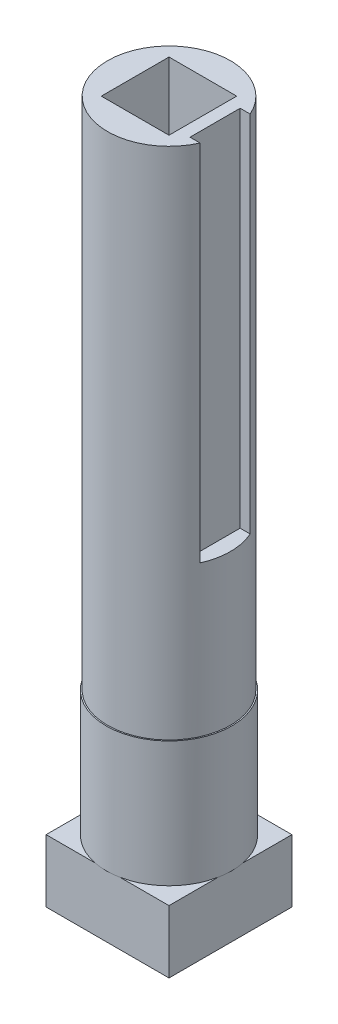
ISO-10303-21;
HEADER;
FILE_DESCRIPTION(('STEP AP214'),'2;1');
FILE_NAME('part.step','',(''),(''),'','','');
FILE_SCHEMA(('AUTOMOTIVE_DESIGN { 1 0 10303 214 1 1 1 1 }'));
ENDSEC;
DATA;
#1=APPLICATION_CONTEXT('core data for automotive mechanical design processes');
#2=APPLICATION_PROTOCOL_DEFINITION('international standard','automotive_design',2000,#1);
#3=PRODUCT_CONTEXT('',#1,'mechanical');
#4=PRODUCT('Part','Part','',(#3));
#5=PRODUCT_RELATED_PRODUCT_CATEGORY('part','',(#4));
#6=PRODUCT_DEFINITION_FORMATION('','',#4);
#7=PRODUCT_DEFINITION_CONTEXT('part definition',#1,'design');
#8=PRODUCT_DEFINITION('design','',#6,#7);
#9=PRODUCT_DEFINITION_SHAPE('','',#8);
#10=(LENGTH_UNIT() NAMED_UNIT(*) SI_UNIT(.MILLI.,.METRE.));
#11=(NAMED_UNIT(*) PLANE_ANGLE_UNIT() SI_UNIT($,.RADIAN.));
#12=(NAMED_UNIT(*) SI_UNIT($,.STERADIAN.) SOLID_ANGLE_UNIT());
#13=UNCERTAINTY_MEASURE_WITH_UNIT(LENGTH_MEASURE(1.E-05),#10,'distance_accuracy_value','');
#14=(GEOMETRIC_REPRESENTATION_CONTEXT(3) GLOBAL_UNCERTAINTY_ASSIGNED_CONTEXT((#13)) GLOBAL_UNIT_ASSIGNED_CONTEXT((#10,
#11,#12)) REPRESENTATION_CONTEXT('',''));
#15=CARTESIAN_POINT('',(0.,0.,0.));
#16=DIRECTION('',(0.,0.,1.));
#17=DIRECTION('',(1.,0.,0.));
#18=AXIS2_PLACEMENT_3D('',#15,#16,#17);
#19=CARTESIAN_POINT('',(6.52000458146904,-10.0241955900503,17.0933548593497));
#20=DIRECTION('',(0.,-1.,0.));
#21=DIRECTION('',(0.,0.,-1.));
#22=AXIS2_PLACEMENT_3D('',#19,#20,#21);
#23=CYLINDRICAL_SURFACE('',#22,2.45);
#24=CARTESIAN_POINT('',(6.52000458146904,-22.7241955900503,17.0933548593497));
#25=DIRECTION('',(0.,1.,0.));
#26=DIRECTION('',(0.,0.,1.));
#27=AXIS2_PLACEMENT_3D('',#24,#25,#26);
#28=CIRCLE('',#27,2.45);
#29=CARTESIAN_POINT('',(6.52000458146904,-22.7241955900503,19.5433548593498));
#30=VERTEX_POINT('',#29);
#31=EDGE_CURVE('E49',#30,#30,#28,.T.);
#32=ORIENTED_EDGE('',*,*,#31,.T.);
#33=EDGE_LOOP('',(#32));
#34=FACE_BOUND('',#33,.T.);
#35=DIRECTION('',(0.,1.,0.));
#36=VECTOR('',#35,1.);
#37=CARTESIAN_POINT('',(8.75663150610354,-16.7241955900503,18.0933548593497));
#38=LINE('',#37,#36);
#39=CARTESIAN_POINT('',(8.75663150610354,-16.7241955900503,18.0933548593497));
#40=VERTEX_POINT('',#39);
#41=CARTESIAN_POINT('',(8.75663150610354,-2.22419559005031,18.0933548593497));
#42=VERTEX_POINT('',#41);
#43=EDGE_CURVE('E295',#40,#42,#38,.T.);
#44=ORIENTED_EDGE('',*,*,#43,.T.);
#45=CARTESIAN_POINT('',(6.52000458146904,-2.22419559005031,17.0933548593497));
#46=DIRECTION('',(0.,1.,0.));
#47=DIRECTION('',(0.,0.,1.));
#48=AXIS2_PLACEMENT_3D('',#45,#46,#47);
#49=CIRCLE('',#48,2.45);
#50=CARTESIAN_POINT('',(8.75663150610354,-2.22419559005031,16.0933548593497));
#51=VERTEX_POINT('',#50);
#52=EDGE_CURVE('E259',#51,#42,#49,.T.);
#53=ORIENTED_EDGE('',*,*,#52,.F.);
#54=DIRECTION('',(0.,1.,0.));
#55=VECTOR('',#54,1.);
#56=CARTESIAN_POINT('',(8.75663150610354,-16.7241955900503,16.0933548593497));
#57=LINE('',#56,#55);
#58=CARTESIAN_POINT('',(8.75663150610354,-16.7241955900503,16.0933548593497));
#59=VERTEX_POINT('',#58);
#60=EDGE_CURVE('E69',#59,#51,#57,.T.);
#61=ORIENTED_EDGE('',*,*,#60,.F.);
#62=CARTESIAN_POINT('',(6.52000458146904,-16.7241955900503,17.0933548593497));
#63=DIRECTION('',(0.,1.,0.));
#64=DIRECTION('',(0.,0.,1.));
#65=AXIS2_PLACEMENT_3D('',#62,#63,#64);
#66=CIRCLE('',#65,2.45);
#67=EDGE_CURVE('E282',#40,#59,#66,.T.);
#68=ORIENTED_EDGE('',*,*,#67,.F.);
#69=EDGE_LOOP('',(#44,#53,#61,#68));
#70=FACE_BOUND('',#69,.T.);
#71=ADVANCED_FACE('F45',(#34,#70),#23,.T.);
#72=CARTESIAN_POINT('',(6.52000458146904,-2.22419559005031,17.0933548593497));
#73=DIRECTION('',(0.,1.,0.));
#74=DIRECTION('',(0.,0.,1.));
#75=AXIS2_PLACEMENT_3D('',#72,#73,#74);
#76=PLANE('',#75);
#77=DIRECTION('',(1.,0.,0.));
#78=VECTOR('',#77,1.);
#79=CARTESIAN_POINT('',(11.1364308665628,-2.22419559005031,18.4433548593497));
#80=LINE('',#79,#78);
#81=CARTESIAN_POINT('',(5.17000458146904,-2.22419559005031,18.4433548593497));
#82=VERTEX_POINT('',#81);
#83=CARTESIAN_POINT('',(7.87000458146904,-2.22419559005031,18.4433548593497));
#84=VERTEX_POINT('',#83);
#85=EDGE_CURVE('E309',#82,#84,#80,.T.);
#86=ORIENTED_EDGE('',*,*,#85,.F.);
#87=DIRECTION('',(0.,0.,-1.));
#88=VECTOR('',#87,1.);
#89=CARTESIAN_POINT('',(5.17000458146904,-2.22419559005031,2.5256151772112));
#90=LINE('',#89,#88);
#91=CARTESIAN_POINT('',(5.17000458146904,-2.22419559005031,15.7433548593497));
#92=VERTEX_POINT('',#91);
#93=EDGE_CURVE('E323',#82,#92,#90,.T.);
#94=ORIENTED_EDGE('',*,*,#93,.T.);
#95=DIRECTION('',(1.,0.,0.));
#96=VECTOR('',#95,1.);
#97=CARTESIAN_POINT('',(11.1364308665628,-2.22419559005031,15.7433548593497));
#98=LINE('',#97,#96);
#99=CARTESIAN_POINT('',(7.87000458146904,-2.22419559005031,15.7433548593497));
#100=VERTEX_POINT('',#99);
#101=EDGE_CURVE('E340',#92,#100,#98,.T.);
#102=ORIENTED_EDGE('',*,*,#101,.T.);
#103=DIRECTION('',(0.,0.,-1.));
#104=VECTOR('',#103,1.);
#105=CARTESIAN_POINT('',(7.87000458146904,-2.22419559005031,2.5256151772112));
#106=LINE('',#105,#104);
#107=EDGE_CURVE('E336',#84,#100,#106,.T.);
#108=ORIENTED_EDGE('',*,*,#107,.F.);
#109=EDGE_LOOP('',(#86,#94,#102,#108));
#110=FACE_BOUND('',#109,.T.);
#111=ORIENTED_EDGE('',*,*,#52,.T.);
#112=DIRECTION('',(-1.,0.,0.));
#113=VECTOR('',#112,1.);
#114=CARTESIAN_POINT('',(11.1364308665628,-2.22419559005031,18.0933548593497));
#115=LINE('',#114,#113);
#116=CARTESIAN_POINT('',(8.35663150610354,-2.22419559005031,18.0933548593497));
#117=VERTEX_POINT('',#116);
#118=EDGE_CURVE('E296',#42,#117,#115,.T.);
#119=ORIENTED_EDGE('',*,*,#118,.T.);
#120=DIRECTION('',(0.,0.,1.));
#121=VECTOR('',#120,1.);
#122=CARTESIAN_POINT('',(8.35663150610354,-2.22419559005031,2.5256151772112));
#123=LINE('',#122,#121);
#124=CARTESIAN_POINT('',(8.35663150610354,-2.22419559005031,16.0933548593497));
#125=VERTEX_POINT('',#124);
#126=EDGE_CURVE('E283',#125,#117,#123,.T.);
#127=ORIENTED_EDGE('',*,*,#126,.F.);
#128=DIRECTION('',(-1.,0.,0.));
#129=VECTOR('',#128,1.);
#130=CARTESIAN_POINT('',(11.1364308665628,-2.22419559005031,16.0933548593497));
#131=LINE('',#130,#129);
#132=EDGE_CURVE('E300',#51,#125,#131,.T.);
#133=ORIENTED_EDGE('',*,*,#132,.F.);
#134=EDGE_LOOP('',(#111,#119,#127,#133));
#135=FACE_BOUND('',#134,.T.);
#136=ADVANCED_FACE('F366',(#110,#135),#76,.T.);
#137=CARTESIAN_POINT('',(11.1364308665628,-5.22419559005031,18.4433548593497));
#138=DIRECTION('',(0.,0.,1.));
#139=DIRECTION('',(1.,0.,0.));
#140=AXIS2_PLACEMENT_3D('',#137,#138,#139);
#141=PLANE('',#140);
#142=ORIENTED_EDGE('',*,*,#85,.T.);
#143=DIRECTION('',(0.,1.,0.));
#144=VECTOR('',#143,1.);
#145=CARTESIAN_POINT('',(7.87000458146904,-5.22419559005031,18.4433548593497));
#146=LINE('',#145,#144);
#147=CARTESIAN_POINT('',(7.87000458146904,-5.22419559005031,18.4433548593497));
#148=VERTEX_POINT('',#147);
#149=EDGE_CURVE('E333',#148,#84,#146,.T.);
#150=ORIENTED_EDGE('',*,*,#149,.F.);
#151=DIRECTION('',(1.,0.,0.));
#152=VECTOR('',#151,1.);
#153=CARTESIAN_POINT('',(11.1364308665628,-5.22419559005031,18.4433548593497));
#154=LINE('',#153,#152);
#155=CARTESIAN_POINT('',(5.17000458146904,-5.22419559005031,18.4433548593497));
#156=VERTEX_POINT('',#155);
#157=EDGE_CURVE('E318',#156,#148,#154,.T.);
#158=ORIENTED_EDGE('',*,*,#157,.F.);
#159=DIRECTION('',(0.,1.,0.));
#160=VECTOR('',#159,1.);
#161=CARTESIAN_POINT('',(5.17000458146904,-5.22419559005031,18.4433548593497));
#162=LINE('',#161,#160);
#163=EDGE_CURVE('E264',#156,#82,#162,.T.);
#164=ORIENTED_EDGE('',*,*,#163,.T.);
#165=EDGE_LOOP('',(#142,#150,#158,#164));
#166=FACE_BOUND('',#165,.T.);
#167=ADVANCED_FACE('F377',(#166),#141,.F.);
#168=CARTESIAN_POINT('',(5.17000458146904,-5.22419559005031,2.5256151772112));
#169=DIRECTION('',(1.,0.,0.));
#170=DIRECTION('',(0.,0.,-1.));
#171=AXIS2_PLACEMENT_3D('',#168,#169,#170);
#172=PLANE('',#171);
#173=ORIENTED_EDGE('',*,*,#93,.F.);
#174=ORIENTED_EDGE('',*,*,#163,.F.);
#175=DIRECTION('',(0.,0.,-1.));
#176=VECTOR('',#175,1.);
#177=CARTESIAN_POINT('',(5.17000458146904,-5.22419559005031,2.5256151772112));
#178=LINE('',#177,#176);
#179=CARTESIAN_POINT('',(5.17000458146904,-5.22419559005031,15.7433548593497));
#180=VERTEX_POINT('',#179);
#181=EDGE_CURVE('E330',#156,#180,#178,.T.);
#182=ORIENTED_EDGE('',*,*,#181,.T.);
#183=DIRECTION('',(0.,1.,0.));
#184=VECTOR('',#183,1.);
#185=CARTESIAN_POINT('',(5.17000458146904,-5.22419559005031,15.7433548593497));
#186=LINE('',#185,#184);
#187=EDGE_CURVE('E349',#180,#92,#186,.T.);
#188=ORIENTED_EDGE('',*,*,#187,.T.);
#189=EDGE_LOOP('',(#173,#174,#182,#188));
#190=FACE_BOUND('',#189,.T.);
#191=ADVANCED_FACE('F379',(#190),#172,.T.);
#192=CARTESIAN_POINT('',(11.1364308665628,-5.22419559005031,15.7433548593497));
#193=DIRECTION('',(0.,0.,1.));
#194=DIRECTION('',(1.,0.,0.));
#195=AXIS2_PLACEMENT_3D('',#192,#193,#194);
#196=PLANE('',#195);
#197=ORIENTED_EDGE('',*,*,#101,.F.);
#198=ORIENTED_EDGE('',*,*,#187,.F.);
#199=DIRECTION('',(1.,0.,0.));
#200=VECTOR('',#199,1.);
#201=CARTESIAN_POINT('',(11.1364308665628,-5.22419559005031,15.7433548593497));
#202=LINE('',#201,#200);
#203=CARTESIAN_POINT('',(7.87000458146904,-5.22419559005031,15.7433548593497));
#204=VERTEX_POINT('',#203);
#205=EDGE_CURVE('E327',#180,#204,#202,.T.);
#206=ORIENTED_EDGE('',*,*,#205,.T.);
#207=DIRECTION('',(0.,1.,0.));
#208=VECTOR('',#207,1.);
#209=CARTESIAN_POINT('',(7.87000458146904,-5.22419559005031,15.7433548593497));
#210=LINE('',#209,#208);
#211=EDGE_CURVE('E352',#204,#100,#210,.T.);
#212=ORIENTED_EDGE('',*,*,#211,.T.);
#213=EDGE_LOOP('',(#197,#198,#206,#212));
#214=FACE_BOUND('',#213,.T.);
#215=ADVANCED_FACE('F372',(#214),#196,.T.);
#216=CARTESIAN_POINT('',(7.87000458146904,-5.22419559005031,2.5256151772112));
#217=DIRECTION('',(1.,0.,0.));
#218=DIRECTION('',(0.,0.,-1.));
#219=AXIS2_PLACEMENT_3D('',#216,#217,#218);
#220=PLANE('',#219);
#221=ORIENTED_EDGE('',*,*,#107,.T.);
#222=ORIENTED_EDGE('',*,*,#211,.F.);
#223=DIRECTION('',(0.,0.,-1.));
#224=VECTOR('',#223,1.);
#225=CARTESIAN_POINT('',(7.87000458146904,-5.22419559005031,2.5256151772112));
#226=LINE('',#225,#224);
#227=EDGE_CURVE('E322',#148,#204,#226,.T.);
#228=ORIENTED_EDGE('',*,*,#227,.F.);
#229=ORIENTED_EDGE('',*,*,#149,.T.);
#230=EDGE_LOOP('',(#221,#222,#228,#229));
#231=FACE_BOUND('',#230,.T.);
#232=ADVANCED_FACE('F360',(#231),#220,.F.);
#233=CARTESIAN_POINT('',(11.1364308665628,-5.22419559005031,2.5256151772112));
#234=DIRECTION('',(0.,1.,0.));
#235=DIRECTION('',(0.,0.,1.));
#236=AXIS2_PLACEMENT_3D('',#233,#234,#235);
#237=PLANE('',#236);
#238=ORIENTED_EDGE('',*,*,#157,.T.);
#239=ORIENTED_EDGE('',*,*,#227,.T.);
#240=ORIENTED_EDGE('',*,*,#205,.F.);
#241=ORIENTED_EDGE('',*,*,#181,.F.);
#242=EDGE_LOOP('',(#238,#239,#240,#241));
#243=FACE_BOUND('',#242,.T.);
#244=ADVANCED_FACE('F375',(#243),#237,.T.);
#245=CARTESIAN_POINT('',(11.1364308665628,-16.7241955900503,18.0933548593497));
#246=DIRECTION('',(0.,0.,-1.));
#247=DIRECTION('',(-1.,0.,0.));
#248=AXIS2_PLACEMENT_3D('',#245,#246,#247);
#249=PLANE('',#248);
#250=ORIENTED_EDGE('',*,*,#118,.F.);
#251=ORIENTED_EDGE('',*,*,#43,.F.);
#252=DIRECTION('',(-1.,0.,0.));
#253=VECTOR('',#252,1.);
#254=CARTESIAN_POINT('',(11.1364308665628,-16.7241955900503,18.0933548593497));
#255=LINE('',#254,#253);
#256=CARTESIAN_POINT('',(8.35663150610354,-16.7241955900503,18.0933548593497));
#257=VERTEX_POINT('',#256);
#258=EDGE_CURVE('E279',#40,#257,#255,.T.);
#259=ORIENTED_EDGE('',*,*,#258,.T.);
#260=DIRECTION('',(0.,1.,0.));
#261=VECTOR('',#260,1.);
#262=CARTESIAN_POINT('',(8.35663150610354,-16.7241955900503,18.0933548593497));
#263=LINE('',#262,#261);
#264=EDGE_CURVE('E306',#257,#117,#263,.T.);
#265=ORIENTED_EDGE('',*,*,#264,.T.);
#266=EDGE_LOOP('',(#250,#251,#259,#265));
#267=FACE_BOUND('',#266,.T.);
#268=ADVANCED_FACE('F475',(#267),#249,.T.);
#269=CARTESIAN_POINT('',(8.35663150610354,-16.7241955900503,2.5256151772112));
#270=DIRECTION('',(-1.,0.,0.));
#271=DIRECTION('',(0.,0.,1.));
#272=AXIS2_PLACEMENT_3D('',#269,#270,#271);
#273=PLANE('',#272);
#274=ORIENTED_EDGE('',*,*,#126,.T.);
#275=ORIENTED_EDGE('',*,*,#264,.F.);
#276=DIRECTION('',(0.,0.,1.));
#277=VECTOR('',#276,1.);
#278=CARTESIAN_POINT('',(8.35663150610354,-16.7241955900503,2.5256151772112));
#279=LINE('',#278,#277);
#280=CARTESIAN_POINT('',(8.35663150610354,-16.7241955900503,16.0933548593497));
#281=VERTEX_POINT('',#280);
#282=EDGE_CURVE('E291',#281,#257,#279,.T.);
#283=ORIENTED_EDGE('',*,*,#282,.F.);
#284=DIRECTION('',(0.,1.,0.));
#285=VECTOR('',#284,1.);
#286=CARTESIAN_POINT('',(8.35663150610354,-16.7241955900503,16.0933548593497));
#287=LINE('',#286,#285);
#288=EDGE_CURVE('E310',#281,#125,#287,.T.);
#289=ORIENTED_EDGE('',*,*,#288,.T.);
#290=EDGE_LOOP('',(#274,#275,#283,#289));
#291=FACE_BOUND('',#290,.T.);
#292=ADVANCED_FACE('F468',(#291),#273,.F.);
#293=CARTESIAN_POINT('',(11.1364308665628,-16.7241955900503,16.0933548593497));
#294=DIRECTION('',(0.,0.,-1.));
#295=DIRECTION('',(-1.,0.,0.));
#296=AXIS2_PLACEMENT_3D('',#293,#294,#295);
#297=PLANE('',#296);
#298=ORIENTED_EDGE('',*,*,#132,.T.);
#299=ORIENTED_EDGE('',*,*,#288,.F.);
#300=DIRECTION('',(-1.,0.,0.));
#301=VECTOR('',#300,1.);
#302=CARTESIAN_POINT('',(11.1364308665628,-16.7241955900503,16.0933548593497));
#303=LINE('',#302,#301);
#304=EDGE_CURVE('E287',#59,#281,#303,.T.);
#305=ORIENTED_EDGE('',*,*,#304,.F.);
#306=ORIENTED_EDGE('',*,*,#60,.T.);
#307=EDGE_LOOP('',(#298,#299,#305,#306));
#308=FACE_BOUND('',#307,.T.);
#309=ADVANCED_FACE('F460',(#308),#297,.F.);
#310=CARTESIAN_POINT('',(11.1364308665628,-16.7241955900503,2.5256151772112));
#311=DIRECTION('',(0.,1.,0.));
#312=DIRECTION('',(0.,0.,1.));
#313=AXIS2_PLACEMENT_3D('',#310,#311,#312);
#314=PLANE('',#313);
#315=ORIENTED_EDGE('',*,*,#258,.F.);
#316=ORIENTED_EDGE('',*,*,#67,.T.);
#317=ORIENTED_EDGE('',*,*,#304,.T.);
#318=ORIENTED_EDGE('',*,*,#282,.T.);
#319=EDGE_LOOP('',(#315,#316,#317,#318));
#320=FACE_BOUND('',#319,.T.);
#321=ADVANCED_FACE('F440',(#320),#314,.T.);
#322=CARTESIAN_POINT('',(6.52000458146904,-27.7241955900503,17.0933548593497));
#323=DIRECTION('',(0.,1.,0.));
#324=DIRECTION('',(0.,0.,1.));
#325=AXIS2_PLACEMENT_3D('',#322,#323,#324);
#326=PLANE('',#325);
#327=CARTESIAN_POINT('',(6.52000458146904,-27.7241955900503,17.0933548593497));
#328=DIRECTION('',(0.,1.,0.));
#329=DIRECTION('',(0.,0.,1.));
#330=AXIS2_PLACEMENT_3D('',#327,#328,#329);
#331=CIRCLE('',#330,2.5);
#332=CARTESIAN_POINT('',(6.02251086291573,-27.7241955900503,19.5433548593498));
#333=VERTEX_POINT('',#332);
#334=CARTESIAN_POINT('',(7.01749830002234,-27.7241955900503,19.5433548593498));
#335=VERTEX_POINT('',#334);
#336=EDGE_CURVE('E163',#333,#335,#331,.T.);
#337=ORIENTED_EDGE('',*,*,#336,.F.);
#338=DIRECTION('',(1.,0.,0.));
#339=VECTOR('',#338,1.);
#340=CARTESIAN_POINT('',(4.07000458146903,-27.7241955900503,19.5433548593498));
#341=LINE('',#340,#339);
#342=EDGE_CURVE('E160',#333,#335,#341,.T.);
#343=ORIENTED_EDGE('',*,*,#342,.T.);
#344=EDGE_LOOP('',(#337,#343));
#345=FACE_BOUND('',#344,.T.);
#346=ADVANCED_FACE('F162',(#345),#326,.F.);
#347=CARTESIAN_POINT('',(8.97000458146904,-27.7241955900503,17.5908485779031));
#348=VERTEX_POINT('',#347);
#349=CARTESIAN_POINT('',(8.97000458146904,-27.7241955900503,16.5958611407964));
#350=VERTEX_POINT('',#349);
#351=EDGE_CURVE('E189',#348,#350,#331,.T.);
#352=ORIENTED_EDGE('',*,*,#351,.F.);
#353=DIRECTION('',(0.,0.,-1.));
#354=VECTOR('',#353,1.);
#355=CARTESIAN_POINT('',(8.97000458146904,-27.7241955900503,19.5433548593498));
#356=LINE('',#355,#354);
#357=EDGE_CURVE('E206',#348,#350,#356,.T.);
#358=ORIENTED_EDGE('',*,*,#357,.T.);
#359=EDGE_LOOP('',(#352,#358));
#360=FACE_BOUND('',#359,.T.);
#361=ADVANCED_FACE('F271',(#360),#326,.F.);
#362=DIRECTION('',(1.,0.,0.));
#363=VECTOR('',#362,1.);
#364=CARTESIAN_POINT('',(4.07000458146903,-27.7241955900503,14.6433548593497));
#365=LINE('',#364,#363);
#366=CARTESIAN_POINT('',(6.02251086291573,-27.7241955900503,14.6433548593497));
#367=VERTEX_POINT('',#366);
#368=CARTESIAN_POINT('',(7.01749830002234,-27.7241955900503,14.6433548593497));
#369=VERTEX_POINT('',#368);
#370=EDGE_CURVE('E217',#367,#369,#365,.T.);
#371=ORIENTED_EDGE('',*,*,#370,.F.);
#372=EDGE_CURVE('E276',#369,#367,#331,.T.);
#373=ORIENTED_EDGE('',*,*,#372,.F.);
#374=EDGE_LOOP('',(#371,#373));
#375=FACE_BOUND('',#374,.T.);
#376=ADVANCED_FACE('F432',(#375),#326,.F.);
#377=CARTESIAN_POINT('',(6.52000458146904,-22.7241955900503,17.0933548593497));
#378=DIRECTION('',(0.,-1.,0.));
#379=DIRECTION('',(0.,0.,-1.));
#380=AXIS2_PLACEMENT_3D('',#377,#378,#379);
#381=CYLINDRICAL_SURFACE('',#380,2.5);
#382=CARTESIAN_POINT('',(6.52000458146904,-22.7241955900503,17.0933548593497));
#383=DIRECTION('',(0.,1.,0.));
#384=DIRECTION('',(0.,0.,1.));
#385=AXIS2_PLACEMENT_3D('',#382,#383,#384);
#386=CIRCLE('',#385,2.5);
#387=CARTESIAN_POINT('',(6.52000458146904,-22.7241955900503,19.5933548593497));
#388=VERTEX_POINT('',#387);
#389=EDGE_CURVE('E188',#388,#388,#386,.T.);
#390=ORIENTED_EDGE('',*,*,#389,.F.);
#391=EDGE_LOOP('',(#390));
#392=FACE_BOUND('',#391,.T.);
#393=EDGE_CURVE('E177',#335,#348,#331,.T.);
#394=ORIENTED_EDGE('',*,*,#393,.T.);
#395=ORIENTED_EDGE('',*,*,#351,.T.);
#396=EDGE_CURVE('E274',#350,#369,#331,.T.);
#397=ORIENTED_EDGE('',*,*,#396,.T.);
#398=ORIENTED_EDGE('',*,*,#372,.T.);
#399=CARTESIAN_POINT('',(4.07000458146903,-27.7241955900503,16.5958611407964));
#400=VERTEX_POINT('',#399);
#401=EDGE_CURVE('E424',#367,#400,#331,.T.);
#402=ORIENTED_EDGE('',*,*,#401,.T.);
#403=CARTESIAN_POINT('',(4.07000458146903,-27.7241955900503,17.5908485779031));
#404=VERTEX_POINT('',#403);
#405=EDGE_CURVE('E181',#400,#404,#331,.T.);
#406=ORIENTED_EDGE('',*,*,#405,.T.);
#407=CARTESIAN_POINT('',(6.52000458146904,-27.7241955900503,17.0933548593497));
#408=DIRECTION('',(0.,1.,0.));
#409=DIRECTION('',(0.,0.,1.));
#410=AXIS2_PLACEMENT_3D('',#407,#408,#409);
#411=CIRCLE('',#410,2.5);
#412=EDGE_CURVE('E11',#333,#404,#411,.F.);
#413=ORIENTED_EDGE('',*,*,#412,.F.);
#414=ORIENTED_EDGE('',*,*,#336,.T.);
#415=EDGE_LOOP('',(#394,#395,#397,#398,#402,#406,#413,#414));
#416=FACE_BOUND('',#415,.T.);
#417=ADVANCED_FACE('F175',(#392,#416),#381,.T.);
#418=CARTESIAN_POINT('',(6.52000458146904,-22.7241955900503,17.0933548593497));
#419=DIRECTION('',(0.,1.,0.));
#420=DIRECTION('',(0.,0.,1.));
#421=AXIS2_PLACEMENT_3D('',#418,#419,#420);
#422=PLANE('',#421);
#423=ORIENTED_EDGE('',*,*,#31,.F.);
#424=EDGE_LOOP('',(#423));
#425=FACE_BOUND('',#424,.T.);
#426=ORIENTED_EDGE('',*,*,#389,.T.);
#427=EDGE_LOOP('',(#426));
#428=FACE_BOUND('',#427,.T.);
#429=ADVANCED_FACE('F430',(#425,#428),#422,.T.);
#430=DIRECTION('',(0.,0.,-1.));
#431=VECTOR('',#430,1.);
#432=CARTESIAN_POINT('',(4.07000458146903,-27.7241955900503,19.5433548593498));
#433=LINE('',#432,#431);
#434=EDGE_CURVE('E61',#404,#400,#433,.T.);
#435=ORIENTED_EDGE('',*,*,#434,.F.);
#436=ORIENTED_EDGE('',*,*,#405,.F.);
#437=EDGE_LOOP('',(#435,#436));
#438=FACE_BOUND('',#437,.T.);
#439=ADVANCED_FACE('F406',(#438),#326,.F.);
#440=CARTESIAN_POINT('',(6.52000458146904,-30.2241955900503,17.0933548593497));
#441=DIRECTION('',(0.,1.,0.));
#442=DIRECTION('',(0.,0.,1.));
#443=AXIS2_PLACEMENT_3D('',#440,#441,#442);
#444=PLANE('',#443);
#445=DIRECTION('',(1.,0.,0.));
#446=VECTOR('',#445,1.);
#447=CARTESIAN_POINT('',(4.07000458146903,-30.2241955900503,19.5433548593498));
#448=LINE('',#447,#446);
#449=CARTESIAN_POINT('',(4.07000458146903,-30.2241955900503,19.5433548593498));
#450=VERTEX_POINT('',#449);
#451=CARTESIAN_POINT('',(8.97000458146904,-30.2241955900503,19.5433548593498));
#452=VERTEX_POINT('',#451);
#453=EDGE_CURVE('E255',#450,#452,#448,.T.);
#454=ORIENTED_EDGE('',*,*,#453,.F.);
#455=DIRECTION('',(0.,0.,-1.));
#456=VECTOR('',#455,1.);
#457=CARTESIAN_POINT('',(4.07000458146903,-30.2241955900503,19.5433548593498));
#458=LINE('',#457,#456);
#459=CARTESIAN_POINT('',(4.07000458146903,-30.2241955900503,14.6433548593497));
#460=VERTEX_POINT('',#459);
#461=EDGE_CURVE('E194',#450,#460,#458,.T.);
#462=ORIENTED_EDGE('',*,*,#461,.T.);
#463=DIRECTION('',(1.,0.,0.));
#464=VECTOR('',#463,1.);
#465=CARTESIAN_POINT('',(4.07000458146903,-30.2241955900503,14.6433548593497));
#466=LINE('',#465,#464);
#467=CARTESIAN_POINT('',(8.97000458146904,-30.2241955900503,14.6433548593497));
#468=VERTEX_POINT('',#467);
#469=EDGE_CURVE('E197',#460,#468,#466,.T.);
#470=ORIENTED_EDGE('',*,*,#469,.T.);
#471=DIRECTION('',(0.,0.,-1.));
#472=VECTOR('',#471,1.);
#473=CARTESIAN_POINT('',(8.97000458146904,-30.2241955900503,19.5433548593498));
#474=LINE('',#473,#472);
#475=EDGE_CURVE('E253',#452,#468,#474,.T.);
#476=ORIENTED_EDGE('',*,*,#475,.F.);
#477=EDGE_LOOP('',(#454,#462,#470,#476));
#478=FACE_BOUND('',#477,.T.);
#479=ADVANCED_FACE('F267',(#478),#444,.F.);
#480=CARTESIAN_POINT('',(6.52000458146904,-27.7241955900503,17.0933548593497));
#481=DIRECTION('',(0.,1.,0.));
#482=DIRECTION('',(0.,0.,1.));
#483=AXIS2_PLACEMENT_3D('',#480,#481,#482);
#484=PLANE('',#483);
#485=CARTESIAN_POINT('',(4.07000458146903,-27.7241955900503,19.5433548593498));
#486=VERTEX_POINT('',#485);
#487=EDGE_CURVE('E169',#486,#333,#341,.T.);
#488=ORIENTED_EDGE('',*,*,#487,.T.);
#489=ORIENTED_EDGE('',*,*,#412,.T.);
#490=EDGE_CURVE('E230',#486,#404,#433,.T.);
#491=ORIENTED_EDGE('',*,*,#490,.F.);
#492=EDGE_LOOP('',(#488,#489,#491));
#493=FACE_BOUND('',#492,.T.);
#494=ADVANCED_FACE('F399',(#493),#484,.T.);
#495=CARTESIAN_POINT('',(4.07000458146903,-27.7241955900503,19.5433548593498));
#496=DIRECTION('',(-1.,0.,0.));
#497=DIRECTION('',(0.,0.,1.));
#498=AXIS2_PLACEMENT_3D('',#495,#496,#497);
#499=PLANE('',#498);
#500=ORIENTED_EDGE('',*,*,#461,.F.);
#501=DIRECTION('',(0.,-1.,0.));
#502=VECTOR('',#501,1.);
#503=CARTESIAN_POINT('',(4.07000458146903,-27.7241955900503,19.5433548593498));
#504=LINE('',#503,#502);
#505=EDGE_CURVE('E237',#486,#450,#504,.T.);
#506=ORIENTED_EDGE('',*,*,#505,.F.);
#507=ORIENTED_EDGE('',*,*,#490,.T.);
#508=ORIENTED_EDGE('',*,*,#434,.T.);
#509=CARTESIAN_POINT('',(4.07000458146903,-27.7241955900503,14.6433548593497));
#510=VERTEX_POINT('',#509);
#511=EDGE_CURVE('E226',#400,#510,#433,.T.);
#512=ORIENTED_EDGE('',*,*,#511,.T.);
#513=DIRECTION('',(0.,-1.,0.));
#514=VECTOR('',#513,1.);
#515=CARTESIAN_POINT('',(4.07000458146903,-27.7241955900503,14.6433548593497));
#516=LINE('',#515,#514);
#517=EDGE_CURVE('E239',#510,#460,#516,.T.);
#518=ORIENTED_EDGE('',*,*,#517,.T.);
#519=EDGE_LOOP('',(#500,#506,#507,#508,#512,#518));
#520=FACE_BOUND('',#519,.T.);
#521=ADVANCED_FACE('F402',(#520),#499,.T.);
#522=CARTESIAN_POINT('',(4.07000458146903,-27.7241955900503,14.6433548593497));
#523=DIRECTION('',(0.,0.,-1.));
#524=DIRECTION('',(-1.,0.,0.));
#525=AXIS2_PLACEMENT_3D('',#522,#523,#524);
#526=PLANE('',#525);
#527=ORIENTED_EDGE('',*,*,#469,.F.);
#528=ORIENTED_EDGE('',*,*,#517,.F.);
#529=EDGE_CURVE('E218',#510,#367,#365,.T.);
#530=ORIENTED_EDGE('',*,*,#529,.T.);
#531=ORIENTED_EDGE('',*,*,#370,.T.);
#532=CARTESIAN_POINT('',(8.97000458146904,-27.7241955900503,14.6433548593497));
#533=VERTEX_POINT('',#532);
#534=EDGE_CURVE('E215',#369,#533,#365,.T.);
#535=ORIENTED_EDGE('',*,*,#534,.T.);
#536=DIRECTION('',(0.,-1.,0.));
#537=VECTOR('',#536,1.);
#538=CARTESIAN_POINT('',(8.97000458146904,-27.7241955900503,14.6433548593497));
#539=LINE('',#538,#537);
#540=EDGE_CURVE('E243',#533,#468,#539,.T.);
#541=ORIENTED_EDGE('',*,*,#540,.T.);
#542=EDGE_LOOP('',(#527,#528,#530,#531,#535,#541));
#543=FACE_BOUND('',#542,.T.);
#544=ADVANCED_FACE('F268',(#543),#526,.T.);
#545=CARTESIAN_POINT('',(8.97000458146904,-27.7241955900503,19.5433548593498));
#546=DIRECTION('',(-1.,0.,0.));
#547=DIRECTION('',(0.,0.,1.));
#548=AXIS2_PLACEMENT_3D('',#545,#546,#547);
#549=PLANE('',#548);
#550=ORIENTED_EDGE('',*,*,#475,.T.);
#551=ORIENTED_EDGE('',*,*,#540,.F.);
#552=EDGE_CURVE('E202',#350,#533,#356,.T.);
#553=ORIENTED_EDGE('',*,*,#552,.F.);
#554=ORIENTED_EDGE('',*,*,#357,.F.);
#555=CARTESIAN_POINT('',(8.97000458146904,-27.7241955900503,19.5433548593498));
#556=VERTEX_POINT('',#555);
#557=EDGE_CURVE('E186',#556,#348,#356,.T.);
#558=ORIENTED_EDGE('',*,*,#557,.F.);
#559=DIRECTION('',(0.,-1.,0.));
#560=VECTOR('',#559,1.);
#561=CARTESIAN_POINT('',(8.97000458146904,-27.7241955900503,19.5433548593498));
#562=LINE('',#561,#560);
#563=EDGE_CURVE('E55',#556,#452,#562,.T.);
#564=ORIENTED_EDGE('',*,*,#563,.T.);
#565=EDGE_LOOP('',(#550,#551,#553,#554,#558,#564));
#566=FACE_BOUND('',#565,.T.);
#567=ADVANCED_FACE('F252',(#566),#549,.F.);
#568=CARTESIAN_POINT('',(4.07000458146903,-27.7241955900503,19.5433548593498));
#569=DIRECTION('',(0.,0.,-1.));
#570=DIRECTION('',(-1.,0.,0.));
#571=AXIS2_PLACEMENT_3D('',#568,#569,#570);
#572=PLANE('',#571);
#573=ORIENTED_EDGE('',*,*,#453,.T.);
#574=ORIENTED_EDGE('',*,*,#563,.F.);
#575=EDGE_CURVE('E170',#335,#556,#341,.T.);
#576=ORIENTED_EDGE('',*,*,#575,.F.);
#577=ORIENTED_EDGE('',*,*,#342,.F.);
#578=ORIENTED_EDGE('',*,*,#487,.F.);
#579=ORIENTED_EDGE('',*,*,#505,.T.);
#580=EDGE_LOOP('',(#573,#574,#576,#577,#578,#579));
#581=FACE_BOUND('',#580,.T.);
#582=ADVANCED_FACE('F47',(#581),#572,.F.);
#583=ORIENTED_EDGE('',*,*,#511,.F.);
#584=ORIENTED_EDGE('',*,*,#401,.F.);
#585=ORIENTED_EDGE('',*,*,#529,.F.);
#586=EDGE_LOOP('',(#583,#584,#585));
#587=FACE_BOUND('',#586,.T.);
#588=ADVANCED_FACE('F403',(#587),#484,.T.);
#589=ORIENTED_EDGE('',*,*,#534,.F.);
#590=ORIENTED_EDGE('',*,*,#396,.F.);
#591=ORIENTED_EDGE('',*,*,#552,.T.);
#592=EDGE_LOOP('',(#589,#590,#591));
#593=FACE_BOUND('',#592,.T.);
#594=ADVANCED_FACE('F417',(#593),#484,.T.);
#595=ORIENTED_EDGE('',*,*,#557,.T.);
#596=ORIENTED_EDGE('',*,*,#393,.F.);
#597=ORIENTED_EDGE('',*,*,#575,.T.);
#598=EDGE_LOOP('',(#595,#596,#597));
#599=FACE_BOUND('',#598,.T.);
#600=ADVANCED_FACE('F184',(#599),#484,.T.);
#601=CLOSED_SHELL('',(#71,#136,#167,#191,#215,#232,#244,#268,#292,#309,#321,#346,#361,#376,#417,
#429,#439,#479,#494,#521,#544,#567,#582,#588,#594,#600));
#602=MANIFOLD_SOLID_BREP('B2',#601);
#603=ADVANCED_BREP_SHAPE_REPRESENTATION('',(#18,#602),#14);
#604=SHAPE_DEFINITION_REPRESENTATION(#9,#603);
ENDSEC;
END-ISO-10303-21;
